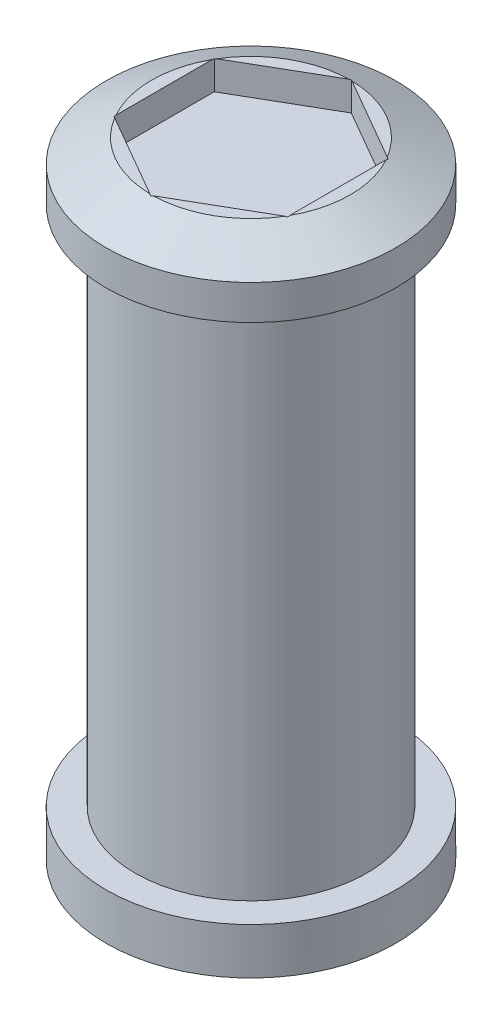
ISO-10303-21;
HEADER;
FILE_DESCRIPTION(('STEP AP214'),'2;1');
FILE_NAME('part.step','',(''),(''),'','','');
FILE_SCHEMA(('AUTOMOTIVE_DESIGN { 1 0 10303 214 1 1 1 1 }'));
ENDSEC;
DATA;
#1=APPLICATION_CONTEXT('core data for automotive mechanical design processes');
#2=APPLICATION_PROTOCOL_DEFINITION('international standard','automotive_design',2000,#1);
#3=PRODUCT_CONTEXT('',#1,'mechanical');
#4=PRODUCT('Part','Part','',(#3));
#5=PRODUCT_RELATED_PRODUCT_CATEGORY('part','',(#4));
#6=PRODUCT_DEFINITION_FORMATION('','',#4);
#7=PRODUCT_DEFINITION_CONTEXT('part definition',#1,'design');
#8=PRODUCT_DEFINITION('design','',#6,#7);
#9=PRODUCT_DEFINITION_SHAPE('','',#8);
#10=(LENGTH_UNIT() NAMED_UNIT(*) SI_UNIT(.MILLI.,.METRE.));
#11=(NAMED_UNIT(*) PLANE_ANGLE_UNIT() SI_UNIT($,.RADIAN.));
#12=(NAMED_UNIT(*) SI_UNIT($,.STERADIAN.) SOLID_ANGLE_UNIT());
#13=UNCERTAINTY_MEASURE_WITH_UNIT(LENGTH_MEASURE(1.E-05),#10,'distance_accuracy_value','');
#14=(GEOMETRIC_REPRESENTATION_CONTEXT(3) GLOBAL_UNCERTAINTY_ASSIGNED_CONTEXT((#13)) GLOBAL_UNIT_ASSIGNED_CONTEXT((#10,
#11,#12)) REPRESENTATION_CONTEXT('',''));
#15=CARTESIAN_POINT('',(0.,0.,0.));
#16=DIRECTION('',(0.,0.,1.));
#17=DIRECTION('',(1.,0.,0.));
#18=AXIS2_PLACEMENT_3D('',#15,#16,#17);
#19=CARTESIAN_POINT('',(0.,254.,0.));
#20=DIRECTION('',(0.,1.,0.));
#21=DIRECTION('',(0.,0.,1.));
#22=AXIS2_PLACEMENT_3D('',#19,#20,#21);
#23=PLANE('',#22);
#24=DIRECTION('',(-0.866025403784439,0.,0.5));
#25=VECTOR('',#24,1.);
#26=CARTESIAN_POINT('',(0.,254.,-43.9940905122495));
#27=LINE('',#26,#25);
#28=CARTESIAN_POINT('',(-0.763675042659631,254.,-43.5531825207965));
#29=VERTEX_POINT('',#28);
#30=CARTESIAN_POINT('',(-37.3363249573404,254.,-22.4379532475777));
#31=VERTEX_POINT('',#30);
#32=EDGE_CURVE('E239',#29,#31,#27,.T.);
#33=ORIENTED_EDGE('',*,*,#32,.F.);
#34=CARTESIAN_POINT('',(0.,254.,0.));
#35=DIRECTION('',(0.,1.,0.));
#36=DIRECTION('',(0.,0.,1.));
#37=AXIS2_PLACEMENT_3D('',#34,#35,#36);
#38=CIRCLE('',#37,43.5598772640672);
#39=EDGE_CURVE('E290',#29,#31,#38,.T.);
#40=ORIENTED_EDGE('',*,*,#39,.T.);
#41=EDGE_LOOP('',(#33,#40));
#42=FACE_BOUND('',#41,.T.);
#43=ADVANCED_FACE('F32',(#42),#23,.T.);
#44=DIRECTION('',(0.,0.,1.));
#45=VECTOR('',#44,1.);
#46=CARTESIAN_POINT('',(-38.1,254.,-21.9970452561247));
#47=LINE('',#46,#45);
#48=CARTESIAN_POINT('',(-38.1,254.,-21.1152292732189));
#49=VERTEX_POINT('',#48);
#50=CARTESIAN_POINT('',(-38.1,254.,21.1152292732189));
#51=VERTEX_POINT('',#50);
#52=EDGE_CURVE('E242',#49,#51,#47,.T.);
#53=ORIENTED_EDGE('',*,*,#52,.F.);
#54=CARTESIAN_POINT('',(0.,254.,0.));
#55=DIRECTION('',(0.,1.,0.));
#56=DIRECTION('',(0.,0.,1.));
#57=AXIS2_PLACEMENT_3D('',#54,#55,#56);
#58=CIRCLE('',#57,43.5598772640672);
#59=EDGE_CURVE('E288',#49,#51,#58,.T.);
#60=ORIENTED_EDGE('',*,*,#59,.T.);
#61=EDGE_LOOP('',(#53,#60));
#62=FACE_BOUND('',#61,.T.);
#63=ADVANCED_FACE('F361',(#62),#23,.T.);
#64=DIRECTION('',(0.866025403784439,0.,0.5));
#65=VECTOR('',#64,1.);
#66=CARTESIAN_POINT('',(-38.1,254.,21.9970452561248));
#67=LINE('',#66,#65);
#68=CARTESIAN_POINT('',(-37.3363249573404,254.,22.4379532475777));
#69=VERTEX_POINT('',#68);
#70=CARTESIAN_POINT('',(-0.763675042659596,254.,43.5531825207966));
#71=VERTEX_POINT('',#70);
#72=EDGE_CURVE('E245',#69,#71,#67,.T.);
#73=ORIENTED_EDGE('',*,*,#72,.F.);
#74=CARTESIAN_POINT('',(0.,254.,0.));
#75=DIRECTION('',(0.,1.,0.));
#76=DIRECTION('',(0.,0.,1.));
#77=AXIS2_PLACEMENT_3D('',#74,#75,#76);
#78=CIRCLE('',#77,43.5598772640672);
#79=EDGE_CURVE('E286',#69,#71,#78,.T.);
#80=ORIENTED_EDGE('',*,*,#79,.T.);
#81=EDGE_LOOP('',(#73,#80));
#82=FACE_BOUND('',#81,.T.);
#83=ADVANCED_FACE('F368',(#82),#23,.T.);
#84=DIRECTION('',(0.866025403784439,0.,-0.5));
#85=VECTOR('',#84,1.);
#86=CARTESIAN_POINT('',(0.,254.,43.9940905122495));
#87=LINE('',#86,#85);
#88=CARTESIAN_POINT('',(0.763675042659617,254.,43.5531825207966));
#89=VERTEX_POINT('',#88);
#90=CARTESIAN_POINT('',(37.3363249573404,254.,22.4379532475777));
#91=VERTEX_POINT('',#90);
#92=EDGE_CURVE('E248',#89,#91,#87,.T.);
#93=ORIENTED_EDGE('',*,*,#92,.F.);
#94=CARTESIAN_POINT('',(0.,254.,0.));
#95=DIRECTION('',(0.,1.,0.));
#96=DIRECTION('',(0.,0.,1.));
#97=AXIS2_PLACEMENT_3D('',#94,#95,#96);
#98=CIRCLE('',#97,43.5598772640672);
#99=EDGE_CURVE('E284',#89,#91,#98,.T.);
#100=ORIENTED_EDGE('',*,*,#99,.T.);
#101=EDGE_LOOP('',(#93,#100));
#102=FACE_BOUND('',#101,.T.);
#103=ADVANCED_FACE('F389',(#102),#23,.T.);
#104=DIRECTION('',(0.,0.,-1.));
#105=VECTOR('',#104,1.);
#106=CARTESIAN_POINT('',(38.1,254.,21.9970452561247));
#107=LINE('',#106,#105);
#108=CARTESIAN_POINT('',(38.1,254.,21.1152292732189));
#109=VERTEX_POINT('',#108);
#110=CARTESIAN_POINT('',(38.1,254.,-21.1152292732189));
#111=VERTEX_POINT('',#110);
#112=EDGE_CURVE('E221',#109,#111,#107,.T.);
#113=ORIENTED_EDGE('',*,*,#112,.F.);
#114=CARTESIAN_POINT('',(0.,254.,0.));
#115=DIRECTION('',(0.,1.,0.));
#116=DIRECTION('',(0.,0.,1.));
#117=AXIS2_PLACEMENT_3D('',#114,#115,#116);
#118=CIRCLE('',#117,43.5598772640672);
#119=EDGE_CURVE('E282',#109,#111,#118,.T.);
#120=ORIENTED_EDGE('',*,*,#119,.T.);
#121=EDGE_LOOP('',(#113,#120));
#122=FACE_BOUND('',#121,.T.);
#123=ADVANCED_FACE('F377',(#122),#23,.T.);
#124=CARTESIAN_POINT('',(0.,228.6,0.));
#125=DIRECTION('',(0.,-1.,0.));
#126=DIRECTION('',(0.,0.,-1.));
#127=AXIS2_PLACEMENT_3D('',#124,#125,#126);
#128=CYLINDRICAL_SURFACE('',#127,50.8);
#129=CARTESIAN_POINT('',(0.,228.6,0.));
#130=DIRECTION('',(0.,1.,0.));
#131=DIRECTION('',(0.,0.,1.));
#132=AXIS2_PLACEMENT_3D('',#129,#130,#131);
#133=CIRCLE('',#132,50.8);
#134=CARTESIAN_POINT('',(0.,228.6,50.8));
#135=VERTEX_POINT('',#134);
#136=EDGE_CURVE('E277',#135,#135,#133,.T.);
#137=ORIENTED_EDGE('',*,*,#136,.F.);
#138=EDGE_LOOP('',(#137));
#139=FACE_BOUND('',#138,.T.);
#140=CARTESIAN_POINT('',(0.,0.,0.));
#141=DIRECTION('',(0.,-1.,0.));
#142=DIRECTION('',(0.,0.,-1.));
#143=AXIS2_PLACEMENT_3D('',#140,#141,#142);
#144=CIRCLE('',#143,50.8);
#145=CARTESIAN_POINT('',(0.,0.,-50.8));
#146=VERTEX_POINT('',#145);
#147=EDGE_CURVE('E271',#146,#146,#144,.T.);
#148=ORIENTED_EDGE('',*,*,#147,.F.);
#149=EDGE_LOOP('',(#148));
#150=FACE_BOUND('',#149,.T.);
#151=ADVANCED_FACE('F384',(#139,#150),#128,.T.);
#152=CARTESIAN_POINT('',(0.,254.,0.));
#153=DIRECTION('',(0.,-1.,0.));
#154=DIRECTION('',(0.,0.,-1.));
#155=AXIS2_PLACEMENT_3D('',#152,#153,#154);
#156=CYLINDRICAL_SURFACE('',#155,63.5);
#157=CARTESIAN_POINT('',(0.,243.84,0.));
#158=DIRECTION('',(0.,1.,0.));
#159=DIRECTION('',(0.,0.,1.));
#160=AXIS2_PLACEMENT_3D('',#157,#158,#159);
#161=CIRCLE('',#160,63.5);
#162=CARTESIAN_POINT('',(0.,243.84,63.5));
#163=VERTEX_POINT('',#162);
#164=EDGE_CURVE('E340',#163,#163,#161,.F.);
#165=ORIENTED_EDGE('',*,*,#164,.T.);
#166=EDGE_LOOP('',(#165));
#167=FACE_BOUND('',#166,.T.);
#168=CARTESIAN_POINT('',(0.,228.6,0.));
#169=DIRECTION('',(0.,1.,0.));
#170=DIRECTION('',(0.,0.,1.));
#171=AXIS2_PLACEMENT_3D('',#168,#169,#170);
#172=CIRCLE('',#171,63.5);
#173=CARTESIAN_POINT('',(0.,228.6,63.5));
#174=VERTEX_POINT('',#173);
#175=EDGE_CURVE('E274',#174,#174,#172,.T.);
#176=ORIENTED_EDGE('',*,*,#175,.T.);
#177=EDGE_LOOP('',(#176));
#178=FACE_BOUND('',#177,.T.);
#179=ADVANCED_FACE('F375',(#167,#178),#156,.T.);
#180=DIRECTION('',(-0.866025403784439,0.,-0.5));
#181=VECTOR('',#180,1.);
#182=CARTESIAN_POINT('',(38.1,254.,-21.9970452561248));
#183=LINE('',#182,#181);
#184=CARTESIAN_POINT('',(37.3363249573404,254.,-22.4379532475777));
#185=VERTEX_POINT('',#184);
#186=CARTESIAN_POINT('',(0.7636750426596,254.,-43.5531825207966));
#187=VERTEX_POINT('',#186);
#188=EDGE_CURVE('E209',#185,#187,#183,.T.);
#189=ORIENTED_EDGE('',*,*,#188,.F.);
#190=CARTESIAN_POINT('',(0.,254.,0.));
#191=DIRECTION('',(0.,1.,0.));
#192=DIRECTION('',(0.,0.,1.));
#193=AXIS2_PLACEMENT_3D('',#190,#191,#192);
#194=CIRCLE('',#193,43.5598772640672);
#195=EDGE_CURVE('E280',#185,#187,#194,.T.);
#196=ORIENTED_EDGE('',*,*,#195,.T.);
#197=EDGE_LOOP('',(#189,#196));
#198=FACE_BOUND('',#197,.T.);
#199=ADVANCED_FACE('F364',(#198),#23,.T.);
#200=CARTESIAN_POINT('',(0.,228.6,0.));
#201=DIRECTION('',(0.,1.,0.));
#202=DIRECTION('',(0.,0.,1.));
#203=AXIS2_PLACEMENT_3D('',#200,#201,#202);
#204=PLANE('',#203);
#205=ORIENTED_EDGE('',*,*,#136,.T.);
#206=EDGE_LOOP('',(#205));
#207=FACE_BOUND('',#206,.T.);
#208=ORIENTED_EDGE('',*,*,#175,.F.);
#209=EDGE_LOOP('',(#208));
#210=FACE_BOUND('',#209,.T.);
#211=ADVANCED_FACE('F374',(#207,#210),#204,.F.);
#212=CARTESIAN_POINT('',(0.,-25.4,0.));
#213=DIRECTION('',(0.,1.,0.));
#214=DIRECTION('',(0.,0.,1.));
#215=AXIS2_PLACEMENT_3D('',#212,#213,#214);
#216=CYLINDRICAL_SURFACE('',#215,63.5);
#217=CARTESIAN_POINT('',(0.,-20.32,0.));
#218=DIRECTION('',(0.,-1.,0.));
#219=DIRECTION('',(0.,0.,-1.));
#220=AXIS2_PLACEMENT_3D('',#217,#218,#219);
#221=CIRCLE('',#220,63.5);
#222=CARTESIAN_POINT('',(0.,-20.32,63.5));
#223=VERTEX_POINT('',#222);
#224=EDGE_CURVE('E11',#223,#223,#221,.F.);
#225=ORIENTED_EDGE('',*,*,#224,.T.);
#226=EDGE_LOOP('',(#225));
#227=FACE_BOUND('',#226,.T.);
#228=CARTESIAN_POINT('',(0.,0.,0.));
#229=DIRECTION('',(0.,-1.,0.));
#230=DIRECTION('',(0.,0.,-1.));
#231=AXIS2_PLACEMENT_3D('',#228,#229,#230);
#232=CIRCLE('',#231,63.5);
#233=CARTESIAN_POINT('',(0.,0.,-63.5));
#234=VERTEX_POINT('',#233);
#235=EDGE_CURVE('E254',#234,#234,#232,.T.);
#236=ORIENTED_EDGE('',*,*,#235,.T.);
#237=EDGE_LOOP('',(#236));
#238=FACE_BOUND('',#237,.T.);
#239=ADVANCED_FACE('F382',(#227,#238),#216,.T.);
#240=CARTESIAN_POINT('',(0.,-25.4,0.));
#241=DIRECTION('',(0.,-1.,0.));
#242=DIRECTION('',(0.,0.,-1.));
#243=AXIS2_PLACEMENT_3D('',#240,#241,#242);
#244=PLANE('',#243);
#245=CARTESIAN_POINT('',(0.,-25.4,0.));
#246=DIRECTION('',(0.,-1.,0.));
#247=DIRECTION('',(0.,0.,-1.));
#248=AXIS2_PLACEMENT_3D('',#245,#246,#247);
#249=CIRCLE('',#248,45.7839346252882);
#250=CARTESIAN_POINT('',(0.,-25.4,45.7839346252882));
#251=VERTEX_POINT('',#250);
#252=EDGE_CURVE('E40',#251,#251,#249,.T.);
#253=ORIENTED_EDGE('',*,*,#252,.T.);
#254=EDGE_LOOP('',(#253));
#255=FACE_BOUND('',#254,.T.);
#256=DIRECTION('',(0.866025403784439,0.,0.5));
#257=VECTOR('',#256,1.);
#258=CARTESIAN_POINT('',(19.05,-25.4,-32.9955678841871));
#259=LINE('',#258,#257);
#260=CARTESIAN_POINT('',(0.,-25.4,-43.9940905122495));
#261=VERTEX_POINT('',#260);
#262=CARTESIAN_POINT('',(38.1,-25.4,-21.9970452561247));
#263=VERTEX_POINT('',#262);
#264=EDGE_CURVE('E47',#261,#263,#259,.T.);
#265=ORIENTED_EDGE('',*,*,#264,.F.);
#266=DIRECTION('',(0.866025403784439,0.,-0.5));
#267=VECTOR('',#266,1.);
#268=CARTESIAN_POINT('',(-19.05,-25.4,-32.9955678841871));
#269=LINE('',#268,#267);
#270=CARTESIAN_POINT('',(-38.1,-25.4,-21.9970452561247));
#271=VERTEX_POINT('',#270);
#272=EDGE_CURVE('E179',#271,#261,#269,.T.);
#273=ORIENTED_EDGE('',*,*,#272,.F.);
#274=DIRECTION('',(0.,0.,-1.));
#275=VECTOR('',#274,1.);
#276=CARTESIAN_POINT('',(-38.1,-25.4,0.));
#277=LINE('',#276,#275);
#278=CARTESIAN_POINT('',(-38.1,-25.4,21.9970452561247));
#279=VERTEX_POINT('',#278);
#280=EDGE_CURVE('E182',#279,#271,#277,.T.);
#281=ORIENTED_EDGE('',*,*,#280,.F.);
#282=DIRECTION('',(-0.866025403784438,0.,-0.5));
#283=VECTOR('',#282,1.);
#284=CARTESIAN_POINT('',(-19.05,-25.4,32.9955678841871));
#285=LINE('',#284,#283);
#286=CARTESIAN_POINT('',(0.,-25.4,43.9940905122495));
#287=VERTEX_POINT('',#286);
#288=EDGE_CURVE('E202',#287,#279,#285,.T.);
#289=ORIENTED_EDGE('',*,*,#288,.F.);
#290=DIRECTION('',(-0.866025403784439,0.,0.5));
#291=VECTOR('',#290,1.);
#292=CARTESIAN_POINT('',(19.05,-25.4,32.9955678841871));
#293=LINE('',#292,#291);
#294=CARTESIAN_POINT('',(38.1,-25.4,21.9970452561248));
#295=VERTEX_POINT('',#294);
#296=EDGE_CURVE('E199',#295,#287,#293,.T.);
#297=ORIENTED_EDGE('',*,*,#296,.F.);
#298=DIRECTION('',(0.,0.,1.));
#299=VECTOR('',#298,1.);
#300=CARTESIAN_POINT('',(38.1,-25.4,0.));
#301=LINE('',#300,#299);
#302=EDGE_CURVE('E196',#263,#295,#301,.T.);
#303=ORIENTED_EDGE('',*,*,#302,.F.);
#304=EDGE_LOOP('',(#265,#273,#281,#289,#297,#303));
#305=FACE_BOUND('',#304,.T.);
#306=ADVANCED_FACE('F325',(#255,#305),#244,.T.);
#307=CARTESIAN_POINT('',(0.,0.,0.));
#308=DIRECTION('',(0.,-1.,0.));
#309=DIRECTION('',(0.,0.,-1.));
#310=AXIS2_PLACEMENT_3D('',#307,#308,#309);
#311=PLANE('',#310);
#312=ORIENTED_EDGE('',*,*,#147,.T.);
#313=EDGE_LOOP('',(#312));
#314=FACE_BOUND('',#313,.T.);
#315=ORIENTED_EDGE('',*,*,#235,.F.);
#316=EDGE_LOOP('',(#315));
#317=FACE_BOUND('',#316,.T.);
#318=ADVANCED_FACE('F323',(#314,#317),#311,.F.);
#319=CARTESIAN_POINT('',(38.1,241.3,-21.9970452561248));
#320=DIRECTION('',(0.5,0.,-0.866025403784439));
#321=DIRECTION('',(-0.866025403784439,0.,-0.5));
#322=AXIS2_PLACEMENT_3D('',#319,#320,#321);
#323=PLANE('',#322);
#324=DIRECTION('',(0.,1.,0.));
#325=VECTOR('',#324,1.);
#326=CARTESIAN_POINT('',(38.1,241.3,-21.9970452561248));
#327=LINE('',#326,#325);
#328=CARTESIAN_POINT('',(38.1,241.3,-21.9970452561248));
#329=VERTEX_POINT('',#328);
#330=CARTESIAN_POINT('',(38.1,253.778757299543,-21.9970452561248));
#331=VERTEX_POINT('',#330);
#332=EDGE_CURVE('E252',#329,#331,#327,.T.);
#333=ORIENTED_EDGE('',*,*,#332,.T.);
#334=CARTESIAN_POINT('',(38.1,253.778757299543,-21.9970452561248));
#335=CARTESIAN_POINT('',(37.9728376205798,253.816168599574,-22.0704624901138));
#336=CARTESIAN_POINT('',(37.8456168450378,253.853311140992,-22.1439134391195));
#337=CARTESIAN_POINT('',(37.5910584974885,253.927058707829,-22.2908827696015));
#338=CARTESIAN_POINT('',(37.4637209254773,253.963663733229,-22.3644011510802));
#339=CARTESIAN_POINT('',(37.3363249573404,254.,-22.4379532475777));
#340=B_SPLINE_CURVE_WITH_KNOTS('',3,(#334,#335,#336,#337,#338,#339),.UNSPECIFIED.,.F.,.F.,(4,2,
4),(0.,0.454574112990714,0.909148241059594),.UNSPECIFIED.);
#341=EDGE_CURVE('E335',#331,#185,#340,.T.);
#342=ORIENTED_EDGE('',*,*,#341,.T.);
#343=ORIENTED_EDGE('',*,*,#188,.T.);
#344=CARTESIAN_POINT('',(0.7636750426596,254.,-43.5531825207966));
#345=CARTESIAN_POINT('',(0.63627907452272,253.963663733229,-43.6267346172941));
#346=CARTESIAN_POINT('',(0.50894150251149,253.927058707829,-43.7002529987727));
#347=CARTESIAN_POINT('',(0.254383154962159,253.853311140992,-43.8472223292548));
#348=CARTESIAN_POINT('',(0.127162379420184,253.816168599574,-43.9206732782604));
#349=CARTESIAN_POINT('',(0.,253.778757299544,-43.9940905122495));
#350=B_SPLINE_CURVE_WITH_KNOTS('',3,(#344,#345,#346,#347,#348,#349),.UNSPECIFIED.,.F.,.F.,(4,2,
4),(0.,0.454574128068862,0.909148241059571),.UNSPECIFIED.);
#351=CARTESIAN_POINT('',(0.,253.778757299544,-43.9940905122495));
#352=VERTEX_POINT('',#351);
#353=EDGE_CURVE('E329',#187,#352,#350,.T.);
#354=ORIENTED_EDGE('',*,*,#353,.T.);
#355=DIRECTION('',(0.,1.,0.));
#356=VECTOR('',#355,1.);
#357=CARTESIAN_POINT('',(0.,241.3,-43.9940905122495));
#358=LINE('',#357,#356);
#359=CARTESIAN_POINT('',(0.,241.3,-43.9940905122495));
#360=VERTEX_POINT('',#359);
#361=EDGE_CURVE('E236',#360,#352,#358,.T.);
#362=ORIENTED_EDGE('',*,*,#361,.F.);
#363=DIRECTION('',(-0.866025403784439,0.,-0.5));
#364=VECTOR('',#363,1.);
#365=CARTESIAN_POINT('',(38.1,241.3,-21.9970452561248));
#366=LINE('',#365,#364);
#367=EDGE_CURVE('E217',#329,#360,#366,.T.);
#368=ORIENTED_EDGE('',*,*,#367,.F.);
#369=EDGE_LOOP('',(#333,#342,#343,#354,#362,#368));
#370=FACE_BOUND('',#369,.T.);
#371=ADVANCED_FACE('F317',(#370),#323,.F.);
#372=CARTESIAN_POINT('',(38.1,241.3,21.9970452561247));
#373=DIRECTION('',(1.,0.,0.));
#374=DIRECTION('',(0.,0.,-1.));
#375=AXIS2_PLACEMENT_3D('',#372,#373,#374);
#376=PLANE('',#375);
#377=DIRECTION('',(0.,1.,0.));
#378=VECTOR('',#377,1.);
#379=CARTESIAN_POINT('',(38.1,241.3,21.9970452561247));
#380=LINE('',#379,#378);
#381=CARTESIAN_POINT('',(38.1,241.3,21.9970452561247));
#382=VERTEX_POINT('',#381);
#383=CARTESIAN_POINT('',(38.1,253.778757299543,21.9970452561247));
#384=VERTEX_POINT('',#383);
#385=EDGE_CURVE('E255',#382,#384,#380,.T.);
#386=ORIENTED_EDGE('',*,*,#385,.T.);
#387=CARTESIAN_POINT('',(38.1,253.778757299543,21.9970452561247));
#388=CARTESIAN_POINT('',(38.1,253.816168599574,21.8502107881467));
#389=CARTESIAN_POINT('',(38.1,253.853311140992,21.7033088901353));
#390=CARTESIAN_POINT('',(38.1,253.927058707829,21.4093702291712));
#391=CARTESIAN_POINT('',(38.1,253.963663733229,21.2623334662139));
#392=CARTESIAN_POINT('',(38.1,254.,21.1152292732189));
#393=B_SPLINE_CURVE_WITH_KNOTS('',3,(#387,#388,#389,#390,#391,#392),.UNSPECIFIED.,.F.,.F.,(4,2,
4),(0.,0.454574112990712,0.909148241059592),.UNSPECIFIED.);
#394=EDGE_CURVE('E402',#384,#109,#393,.T.);
#395=ORIENTED_EDGE('',*,*,#394,.T.);
#396=ORIENTED_EDGE('',*,*,#112,.T.);
#397=CARTESIAN_POINT('',(38.1,254.,-21.1152292732189));
#398=CARTESIAN_POINT('',(38.1,253.963663733229,-21.2623334662139));
#399=CARTESIAN_POINT('',(38.1,253.927058707829,-21.4093702291712));
#400=CARTESIAN_POINT('',(38.1,253.853311140992,-21.7033088901353));
#401=CARTESIAN_POINT('',(38.1,253.816168599574,-21.8502107881467));
#402=CARTESIAN_POINT('',(38.1,253.778757299543,-21.9970452561248));
#403=B_SPLINE_CURVE_WITH_KNOTS('',3,(#397,#398,#399,#400,#401,#402),.UNSPECIFIED.,.F.,.F.,(4,2,
4),(0.,0.454574128068887,0.909148241059612),.UNSPECIFIED.);
#404=EDGE_CURVE('E55',#111,#331,#403,.T.);
#405=ORIENTED_EDGE('',*,*,#404,.T.);
#406=ORIENTED_EDGE('',*,*,#332,.F.);
#407=DIRECTION('',(0.,0.,-1.));
#408=VECTOR('',#407,1.);
#409=CARTESIAN_POINT('',(38.1,241.3,21.9970452561247));
#410=LINE('',#409,#408);
#411=EDGE_CURVE('E233',#382,#329,#410,.T.);
#412=ORIENTED_EDGE('',*,*,#411,.F.);
#413=EDGE_LOOP('',(#386,#395,#396,#405,#406,#412));
#414=FACE_BOUND('',#413,.T.);
#415=ADVANCED_FACE('F322',(#414),#376,.F.);
#416=CARTESIAN_POINT('',(0.,241.3,43.9940905122495));
#417=DIRECTION('',(0.5,0.,0.866025403784439));
#418=DIRECTION('',(0.866025403784439,0.,-0.5));
#419=AXIS2_PLACEMENT_3D('',#416,#417,#418);
#420=PLANE('',#419);
#421=DIRECTION('',(0.,1.,0.));
#422=VECTOR('',#421,1.);
#423=CARTESIAN_POINT('',(0.,241.3,43.9940905122495));
#424=LINE('',#423,#422);
#425=CARTESIAN_POINT('',(0.,241.3,43.9940905122495));
#426=VERTEX_POINT('',#425);
#427=CARTESIAN_POINT('',(0.,253.778757299544,43.9940905122495));
#428=VERTEX_POINT('',#427);
#429=EDGE_CURVE('E258',#426,#428,#424,.T.);
#430=ORIENTED_EDGE('',*,*,#429,.T.);
#431=CARTESIAN_POINT('',(0.,253.778757299544,43.9940905122495));
#432=CARTESIAN_POINT('',(0.127162379420206,253.816168599574,43.9206732782604));
#433=CARTESIAN_POINT('',(0.254383154962181,253.853311140992,43.8472223292548));
#434=CARTESIAN_POINT('',(0.508941502511509,253.927058707829,43.7002529987727));
#435=CARTESIAN_POINT('',(0.636279074522737,253.963663733229,43.6267346172941));
#436=CARTESIAN_POINT('',(0.763675042659615,254.,43.5531825207966));
#437=B_SPLINE_CURVE_WITH_KNOTS('',3,(#431,#432,#433,#434,#435,#436),.UNSPECIFIED.,.F.,.F.,(4,2,
4),(0.,0.454574112990703,0.909148241059561),.UNSPECIFIED.);
#438=EDGE_CURVE('E405',#428,#89,#437,.T.);
#439=ORIENTED_EDGE('',*,*,#438,.T.);
#440=ORIENTED_EDGE('',*,*,#92,.T.);
#441=CARTESIAN_POINT('',(37.3363249573404,254.,22.4379532475777));
#442=CARTESIAN_POINT('',(37.4637209254773,253.963663733229,22.3644011510802));
#443=CARTESIAN_POINT('',(37.5910584974885,253.927058707829,22.2908827696015));
#444=CARTESIAN_POINT('',(37.8456168450378,253.853311140992,22.1439134391195));
#445=CARTESIAN_POINT('',(37.9728376205798,253.816168599574,22.0704624901138));
#446=CARTESIAN_POINT('',(38.1,253.778757299543,21.9970452561247));
#447=B_SPLINE_CURVE_WITH_KNOTS('',3,(#441,#442,#443,#444,#445,#446),.UNSPECIFIED.,.F.,.F.,(4,2,
4),(0.,0.454574128068887,0.909148241059608),.UNSPECIFIED.);
#448=EDGE_CURVE('E407',#91,#384,#447,.T.);
#449=ORIENTED_EDGE('',*,*,#448,.T.);
#450=ORIENTED_EDGE('',*,*,#385,.F.);
#451=DIRECTION('',(0.866025403784439,0.,-0.5));
#452=VECTOR('',#451,1.);
#453=CARTESIAN_POINT('',(0.,241.3,43.9940905122495));
#454=LINE('',#453,#452);
#455=EDGE_CURVE('E230',#426,#382,#454,.T.);
#456=ORIENTED_EDGE('',*,*,#455,.F.);
#457=EDGE_LOOP('',(#430,#439,#440,#449,#450,#456));
#458=FACE_BOUND('',#457,.T.);
#459=ADVANCED_FACE('F424',(#458),#420,.F.);
#460=CARTESIAN_POINT('',(-38.1,241.3,21.9970452561248));
#461=DIRECTION('',(-0.5,0.,0.866025403784439));
#462=DIRECTION('',(0.866025403784439,0.,0.5));
#463=AXIS2_PLACEMENT_3D('',#460,#461,#462);
#464=PLANE('',#463);
#465=DIRECTION('',(0.,1.,0.));
#466=VECTOR('',#465,1.);
#467=CARTESIAN_POINT('',(-38.1,241.3,21.9970452561248));
#468=LINE('',#467,#466);
#469=CARTESIAN_POINT('',(-38.1,241.3,21.9970452561248));
#470=VERTEX_POINT('',#469);
#471=CARTESIAN_POINT('',(-38.1,253.778757299544,21.9970452561248));
#472=VERTEX_POINT('',#471);
#473=EDGE_CURVE('E261',#470,#472,#468,.T.);
#474=ORIENTED_EDGE('',*,*,#473,.T.);
#475=CARTESIAN_POINT('',(-38.1,253.778757299544,21.9970452561248));
#476=CARTESIAN_POINT('',(-37.9728376205798,253.816168599574,22.0704624901138));
#477=CARTESIAN_POINT('',(-37.8456168450378,253.853311140992,22.1439134391195));
#478=CARTESIAN_POINT('',(-37.5910584974885,253.927058707829,22.2908827696015));
#479=CARTESIAN_POINT('',(-37.4637209254772,253.963663733229,22.3644011510802));
#480=CARTESIAN_POINT('',(-37.3363249573404,254.,22.4379532475777));
#481=B_SPLINE_CURVE_WITH_KNOTS('',3,(#475,#476,#477,#478,#479,#480),.UNSPECIFIED.,.F.,.F.,(4,2,
4),(0.,0.454574112990715,0.90914824105958),.UNSPECIFIED.);
#482=EDGE_CURVE('E437',#472,#69,#481,.T.);
#483=ORIENTED_EDGE('',*,*,#482,.T.);
#484=ORIENTED_EDGE('',*,*,#72,.T.);
#485=CARTESIAN_POINT('',(-0.76367504265961,254.,43.5531825207966));
#486=CARTESIAN_POINT('',(-0.636279074522731,253.963663733229,43.6267346172941));
#487=CARTESIAN_POINT('',(-0.508941502511501,253.927058707829,43.7002529987727));
#488=CARTESIAN_POINT('',(-0.254383154962169,253.853311140992,43.8472223292548));
#489=CARTESIAN_POINT('',(-0.127162379420193,253.816168599574,43.9206732782604));
#490=CARTESIAN_POINT('',(0.,253.778757299544,43.9940905122495));
#491=B_SPLINE_CURVE_WITH_KNOTS('',3,(#485,#486,#487,#488,#489,#490),.UNSPECIFIED.,.F.,.F.,(4,2,
4),(0.,0.454574128068862,0.90914824105957),.UNSPECIFIED.);
#492=EDGE_CURVE('E442',#71,#428,#491,.T.);
#493=ORIENTED_EDGE('',*,*,#492,.T.);
#494=ORIENTED_EDGE('',*,*,#429,.F.);
#495=DIRECTION('',(0.866025403784439,0.,0.5));
#496=VECTOR('',#495,1.);
#497=CARTESIAN_POINT('',(-38.1,241.3,21.9970452561248));
#498=LINE('',#497,#496);
#499=EDGE_CURVE('E227',#470,#426,#498,.T.);
#500=ORIENTED_EDGE('',*,*,#499,.F.);
#501=EDGE_LOOP('',(#474,#483,#484,#493,#494,#500));
#502=FACE_BOUND('',#501,.T.);
#503=ADVANCED_FACE('F429',(#502),#464,.F.);
#504=CARTESIAN_POINT('',(-38.1,241.3,-21.9970452561247));
#505=DIRECTION('',(-1.,0.,0.));
#506=DIRECTION('',(0.,0.,1.));
#507=AXIS2_PLACEMENT_3D('',#504,#505,#506);
#508=PLANE('',#507);
#509=DIRECTION('',(0.,1.,0.));
#510=VECTOR('',#509,1.);
#511=CARTESIAN_POINT('',(-38.1,241.3,-21.9970452561247));
#512=LINE('',#511,#510);
#513=CARTESIAN_POINT('',(-38.1,241.3,-21.9970452561247));
#514=VERTEX_POINT('',#513);
#515=CARTESIAN_POINT('',(-38.1,253.778757299543,-21.9970452561247));
#516=VERTEX_POINT('',#515);
#517=EDGE_CURVE('E264',#514,#516,#512,.T.);
#518=ORIENTED_EDGE('',*,*,#517,.T.);
#519=CARTESIAN_POINT('',(-38.1,253.778757299543,-21.9970452561247));
#520=CARTESIAN_POINT('',(-38.1,253.816168599574,-21.8502107881467));
#521=CARTESIAN_POINT('',(-38.1,253.853311140992,-21.7033088901353));
#522=CARTESIAN_POINT('',(-38.1,253.927058707829,-21.4093702291712));
#523=CARTESIAN_POINT('',(-38.1,253.963663733229,-21.2623334662139));
#524=CARTESIAN_POINT('',(-38.1,254.,-21.1152292732189));
#525=B_SPLINE_CURVE_WITH_KNOTS('',3,(#519,#520,#521,#522,#523,#524),.UNSPECIFIED.,.F.,.F.,(4,2,
4),(0.,0.454574112990719,0.909148241059599),.UNSPECIFIED.);
#526=EDGE_CURVE('E447',#516,#49,#525,.T.);
#527=ORIENTED_EDGE('',*,*,#526,.T.);
#528=ORIENTED_EDGE('',*,*,#52,.T.);
#529=CARTESIAN_POINT('',(-38.1,254.,21.1152292732189));
#530=CARTESIAN_POINT('',(-38.1,253.963663733229,21.2623334662139));
#531=CARTESIAN_POINT('',(-38.1,253.927058707829,21.4093702291712));
#532=CARTESIAN_POINT('',(-38.1,253.853311140992,21.7033088901353));
#533=CARTESIAN_POINT('',(-38.1,253.816168599574,21.8502107881467));
#534=CARTESIAN_POINT('',(-38.1,253.778757299544,21.9970452561248));
#535=B_SPLINE_CURVE_WITH_KNOTS('',3,(#529,#530,#531,#532,#533,#534),.UNSPECIFIED.,.F.,.F.,(4,2,
4),(0.,0.454574128068866,0.909148241059579),.UNSPECIFIED.);
#536=EDGE_CURVE('E451',#51,#472,#535,.T.);
#537=ORIENTED_EDGE('',*,*,#536,.T.);
#538=ORIENTED_EDGE('',*,*,#473,.F.);
#539=DIRECTION('',(0.,0.,1.));
#540=VECTOR('',#539,1.);
#541=CARTESIAN_POINT('',(-38.1,241.3,-21.9970452561247));
#542=LINE('',#541,#540);
#543=EDGE_CURVE('E224',#514,#470,#542,.T.);
#544=ORIENTED_EDGE('',*,*,#543,.F.);
#545=EDGE_LOOP('',(#518,#527,#528,#537,#538,#544));
#546=FACE_BOUND('',#545,.T.);
#547=ADVANCED_FACE('F313',(#546),#508,.F.);
#548=CARTESIAN_POINT('',(0.,241.3,-43.9940905122495));
#549=DIRECTION('',(-0.5,0.,-0.866025403784439));
#550=DIRECTION('',(-0.866025403784439,0.,0.5));
#551=AXIS2_PLACEMENT_3D('',#548,#549,#550);
#552=PLANE('',#551);
#553=ORIENTED_EDGE('',*,*,#32,.T.);
#554=CARTESIAN_POINT('',(-37.3363249573404,254.,-22.4379532475777));
#555=CARTESIAN_POINT('',(-37.4637209254772,253.963663733229,-22.3644011510802));
#556=CARTESIAN_POINT('',(-37.5910584974885,253.927058707829,-22.2908827696015));
#557=CARTESIAN_POINT('',(-37.8456168450378,253.853311140992,-22.1439134391195));
#558=CARTESIAN_POINT('',(-37.9728376205798,253.816168599574,-22.0704624901138));
#559=CARTESIAN_POINT('',(-38.1,253.778757299543,-21.9970452561247));
#560=B_SPLINE_CURVE_WITH_KNOTS('',3,(#554,#555,#556,#557,#558,#559),.UNSPECIFIED.,.F.,.F.,(4,2,
4),(0.,0.454574128068891,0.909148241059628),.UNSPECIFIED.);
#561=EDGE_CURVE('E299',#31,#516,#560,.T.);
#562=ORIENTED_EDGE('',*,*,#561,.T.);
#563=ORIENTED_EDGE('',*,*,#517,.F.);
#564=DIRECTION('',(-0.866025403784439,0.,0.5));
#565=VECTOR('',#564,1.);
#566=CARTESIAN_POINT('',(0.,241.3,-43.9940905122495));
#567=LINE('',#566,#565);
#568=EDGE_CURVE('E220',#360,#514,#567,.T.);
#569=ORIENTED_EDGE('',*,*,#568,.F.);
#570=ORIENTED_EDGE('',*,*,#361,.T.);
#571=CARTESIAN_POINT('',(0.,253.778757299544,-43.9940905122495));
#572=CARTESIAN_POINT('',(-0.127162379420213,253.816168599574,-43.9206732782604));
#573=CARTESIAN_POINT('',(-0.254383154962188,253.853311140992,-43.8472223292548));
#574=CARTESIAN_POINT('',(-0.508941502511519,253.927058707829,-43.7002529987727));
#575=CARTESIAN_POINT('',(-0.636279074522748,253.963663733229,-43.626734617294));
#576=CARTESIAN_POINT('',(-0.763675042659628,254.,-43.5531825207966));
#577=B_SPLINE_CURVE_WITH_KNOTS('',3,(#571,#572,#573,#574,#575,#576),.UNSPECIFIED.,.F.,.F.,(4,2,
4),(0.,0.454574112990708,0.909148241059566),.UNSPECIFIED.);
#578=EDGE_CURVE('E293',#352,#29,#577,.T.);
#579=ORIENTED_EDGE('',*,*,#578,.T.);
#580=EDGE_LOOP('',(#553,#562,#563,#569,#570,#579));
#581=FACE_BOUND('',#580,.T.);
#582=ADVANCED_FACE('F307',(#581),#552,.F.);
#583=CARTESIAN_POINT('',(0.,241.3,0.));
#584=DIRECTION('',(0.,1.,0.));
#585=DIRECTION('',(0.,0.,1.));
#586=AXIS2_PLACEMENT_3D('',#583,#584,#585);
#587=PLANE('',#586);
#588=ORIENTED_EDGE('',*,*,#367,.T.);
#589=ORIENTED_EDGE('',*,*,#568,.T.);
#590=ORIENTED_EDGE('',*,*,#543,.T.);
#591=ORIENTED_EDGE('',*,*,#499,.T.);
#592=ORIENTED_EDGE('',*,*,#455,.T.);
#593=ORIENTED_EDGE('',*,*,#411,.T.);
#594=EDGE_LOOP('',(#588,#589,#590,#591,#592,#593));
#595=FACE_BOUND('',#594,.T.);
#596=ADVANCED_FACE('F312',(#595),#587,.T.);
#597=CARTESIAN_POINT('',(0.,254.,0.));
#598=DIRECTION('',(0.,-1.,0.));
#599=DIRECTION('',(0.,0.,-1.));
#600=AXIS2_PLACEMENT_3D('',#597,#598,#599);
#601=CONICAL_SURFACE('',#600,43.5598772640672,1.09955742875643);
#602=ORIENTED_EDGE('',*,*,#164,.F.);
#603=EDGE_LOOP('',(#602));
#604=FACE_BOUND('',#603,.T.);
#605=ORIENTED_EDGE('',*,*,#561,.F.);
#606=ORIENTED_EDGE('',*,*,#39,.F.);
#607=ORIENTED_EDGE('',*,*,#578,.F.);
#608=ORIENTED_EDGE('',*,*,#353,.F.);
#609=ORIENTED_EDGE('',*,*,#195,.F.);
#610=ORIENTED_EDGE('',*,*,#341,.F.);
#611=ORIENTED_EDGE('',*,*,#404,.F.);
#612=ORIENTED_EDGE('',*,*,#119,.F.);
#613=ORIENTED_EDGE('',*,*,#394,.F.);
#614=ORIENTED_EDGE('',*,*,#448,.F.);
#615=ORIENTED_EDGE('',*,*,#99,.F.);
#616=ORIENTED_EDGE('',*,*,#438,.F.);
#617=ORIENTED_EDGE('',*,*,#492,.F.);
#618=ORIENTED_EDGE('',*,*,#79,.F.);
#619=ORIENTED_EDGE('',*,*,#482,.F.);
#620=ORIENTED_EDGE('',*,*,#536,.F.);
#621=ORIENTED_EDGE('',*,*,#59,.F.);
#622=ORIENTED_EDGE('',*,*,#526,.F.);
#623=EDGE_LOOP('',(#605,#606,#607,#608,#609,#610,#611,#612,#613,#614,#615,#616,#617,#618,#619,
#620,#621,#622));
#624=FACE_BOUND('',#623,.T.);
#625=ADVANCED_FACE('F304',(#604,#624),#601,.T.);
#626=CARTESIAN_POINT('',(19.05,-12.7,-32.9955678841871));
#627=DIRECTION('',(0.5,0.,-0.866025403784439));
#628=DIRECTION('',(-0.866025403784439,0.,-0.5));
#629=AXIS2_PLACEMENT_3D('',#626,#627,#628);
#630=PLANE('',#629);
#631=ORIENTED_EDGE('',*,*,#264,.T.);
#632=DIRECTION('',(0.,-1.,0.));
#633=VECTOR('',#632,1.);
#634=CARTESIAN_POINT('',(38.1,-12.7,-21.9970452561247));
#635=LINE('',#634,#633);
#636=CARTESIAN_POINT('',(38.1,-12.7,-21.9970452561247));
#637=VERTEX_POINT('',#636);
#638=EDGE_CURVE('E156',#637,#263,#635,.T.);
#639=ORIENTED_EDGE('',*,*,#638,.F.);
#640=DIRECTION('',(0.866025403784439,0.,0.5));
#641=VECTOR('',#640,1.);
#642=CARTESIAN_POINT('',(19.05,-12.7,-32.9955678841871));
#643=LINE('',#642,#641);
#644=CARTESIAN_POINT('',(0.,-12.7,-43.9940905122495));
#645=VERTEX_POINT('',#644);
#646=EDGE_CURVE('E160',#645,#637,#643,.T.);
#647=ORIENTED_EDGE('',*,*,#646,.F.);
#648=DIRECTION('',(0.,-1.,0.));
#649=VECTOR('',#648,1.);
#650=CARTESIAN_POINT('',(0.,-12.7,-43.9940905122495));
#651=LINE('',#650,#649);
#652=EDGE_CURVE('E207',#645,#261,#651,.T.);
#653=ORIENTED_EDGE('',*,*,#652,.T.);
#654=EDGE_LOOP('',(#631,#639,#647,#653));
#655=FACE_BOUND('',#654,.T.);
#656=ADVANCED_FACE('F158',(#655),#630,.F.);
#657=CARTESIAN_POINT('',(-19.05,-12.7,-32.9955678841871));
#658=DIRECTION('',(-0.5,0.,-0.866025403784439));
#659=DIRECTION('',(-0.866025403784439,0.,0.5));
#660=AXIS2_PLACEMENT_3D('',#657,#658,#659);
#661=PLANE('',#660);
#662=ORIENTED_EDGE('',*,*,#272,.T.);
#663=ORIENTED_EDGE('',*,*,#652,.F.);
#664=DIRECTION('',(0.866025403784439,0.,-0.5));
#665=VECTOR('',#664,1.);
#666=CARTESIAN_POINT('',(-19.05,-12.7,-32.9955678841871));
#667=LINE('',#666,#665);
#668=CARTESIAN_POINT('',(-38.1,-12.7,-21.9970452561247));
#669=VERTEX_POINT('',#668);
#670=EDGE_CURVE('E166',#669,#645,#667,.T.);
#671=ORIENTED_EDGE('',*,*,#670,.F.);
#672=DIRECTION('',(0.,-1.,0.));
#673=VECTOR('',#672,1.);
#674=CARTESIAN_POINT('',(-38.1,-12.7,-21.9970452561247));
#675=LINE('',#674,#673);
#676=EDGE_CURVE('E210',#669,#271,#675,.T.);
#677=ORIENTED_EDGE('',*,*,#676,.T.);
#678=EDGE_LOOP('',(#662,#663,#671,#677));
#679=FACE_BOUND('',#678,.T.);
#680=ADVANCED_FACE('F555',(#679),#661,.F.);
#681=CARTESIAN_POINT('',(-38.1,-12.7,0.));
#682=DIRECTION('',(-1.,0.,0.));
#683=DIRECTION('',(0.,0.,1.));
#684=AXIS2_PLACEMENT_3D('',#681,#682,#683);
#685=PLANE('',#684);
#686=ORIENTED_EDGE('',*,*,#280,.T.);
#687=ORIENTED_EDGE('',*,*,#676,.F.);
#688=DIRECTION('',(0.,0.,-1.));
#689=VECTOR('',#688,1.);
#690=CARTESIAN_POINT('',(-38.1,-12.7,0.));
#691=LINE('',#690,#689);
#692=CARTESIAN_POINT('',(-38.1,-12.7,21.9970452561247));
#693=VERTEX_POINT('',#692);
#694=EDGE_CURVE('E192',#693,#669,#691,.T.);
#695=ORIENTED_EDGE('',*,*,#694,.F.);
#696=DIRECTION('',(0.,-1.,0.));
#697=VECTOR('',#696,1.);
#698=CARTESIAN_POINT('',(-38.1,-12.7,21.9970452561247));
#699=LINE('',#698,#697);
#700=EDGE_CURVE('E212',#693,#279,#699,.T.);
#701=ORIENTED_EDGE('',*,*,#700,.T.);
#702=EDGE_LOOP('',(#686,#687,#695,#701));
#703=FACE_BOUND('',#702,.T.);
#704=ADVANCED_FACE('F563',(#703),#685,.F.);
#705=CARTESIAN_POINT('',(-19.05,-12.7,32.9955678841871));
#706=DIRECTION('',(-0.5,0.,0.866025403784438));
#707=DIRECTION('',(0.866025403784438,0.,0.5));
#708=AXIS2_PLACEMENT_3D('',#705,#706,#707);
#709=PLANE('',#708);
#710=ORIENTED_EDGE('',*,*,#288,.T.);
#711=ORIENTED_EDGE('',*,*,#700,.F.);
#712=DIRECTION('',(-0.866025403784438,0.,-0.5));
#713=VECTOR('',#712,1.);
#714=CARTESIAN_POINT('',(-19.05,-12.7,32.9955678841871));
#715=LINE('',#714,#713);
#716=CARTESIAN_POINT('',(0.,-12.7,43.9940905122495));
#717=VERTEX_POINT('',#716);
#718=EDGE_CURVE('E189',#717,#693,#715,.T.);
#719=ORIENTED_EDGE('',*,*,#718,.F.);
#720=DIRECTION('',(0.,-1.,0.));
#721=VECTOR('',#720,1.);
#722=CARTESIAN_POINT('',(0.,-12.7,43.9940905122495));
#723=LINE('',#722,#721);
#724=EDGE_CURVE('E214',#717,#287,#723,.T.);
#725=ORIENTED_EDGE('',*,*,#724,.T.);
#726=EDGE_LOOP('',(#710,#711,#719,#725));
#727=FACE_BOUND('',#726,.T.);
#728=ADVANCED_FACE('F573',(#727),#709,.F.);
#729=CARTESIAN_POINT('',(19.05,-12.7,32.9955678841871));
#730=DIRECTION('',(0.5,0.,0.866025403784439));
#731=DIRECTION('',(0.866025403784439,0.,-0.5));
#732=AXIS2_PLACEMENT_3D('',#729,#730,#731);
#733=PLANE('',#732);
#734=ORIENTED_EDGE('',*,*,#296,.T.);
#735=ORIENTED_EDGE('',*,*,#724,.F.);
#736=DIRECTION('',(-0.866025403784439,0.,0.5));
#737=VECTOR('',#736,1.);
#738=CARTESIAN_POINT('',(19.05,-12.7,32.9955678841871));
#739=LINE('',#738,#737);
#740=CARTESIAN_POINT('',(38.1,-12.7,21.9970452561248));
#741=VERTEX_POINT('',#740);
#742=EDGE_CURVE('E174',#741,#717,#739,.T.);
#743=ORIENTED_EDGE('',*,*,#742,.F.);
#744=DIRECTION('',(0.,-1.,0.));
#745=VECTOR('',#744,1.);
#746=CARTESIAN_POINT('',(38.1,-12.7,21.9970452561248));
#747=LINE('',#746,#745);
#748=EDGE_CURVE('E165',#741,#295,#747,.T.);
#749=ORIENTED_EDGE('',*,*,#748,.T.);
#750=EDGE_LOOP('',(#734,#735,#743,#749));
#751=FACE_BOUND('',#750,.T.);
#752=ADVANCED_FACE('F583',(#751),#733,.F.);
#753=CARTESIAN_POINT('',(38.1,-12.7,0.));
#754=DIRECTION('',(1.,0.,0.));
#755=DIRECTION('',(0.,0.,-1.));
#756=AXIS2_PLACEMENT_3D('',#753,#754,#755);
#757=PLANE('',#756);
#758=ORIENTED_EDGE('',*,*,#302,.T.);
#759=ORIENTED_EDGE('',*,*,#748,.F.);
#760=DIRECTION('',(0.,0.,1.));
#761=VECTOR('',#760,1.);
#762=CARTESIAN_POINT('',(38.1,-12.7,0.));
#763=LINE('',#762,#761);
#764=EDGE_CURVE('E169',#637,#741,#763,.T.);
#765=ORIENTED_EDGE('',*,*,#764,.F.);
#766=ORIENTED_EDGE('',*,*,#638,.T.);
#767=EDGE_LOOP('',(#758,#759,#765,#766));
#768=FACE_BOUND('',#767,.T.);
#769=ADVANCED_FACE('F170',(#768),#757,.F.);
#770=CARTESIAN_POINT('',(0.,-12.7,0.));
#771=DIRECTION('',(0.,-1.,0.));
#772=DIRECTION('',(0.,0.,-1.));
#773=AXIS2_PLACEMENT_3D('',#770,#771,#772);
#774=PLANE('',#773);
#775=CARTESIAN_POINT('',(0.,-12.7,0.));
#776=DIRECTION('',(0.,-1.,0.));
#777=DIRECTION('',(0.,0.,-1.));
#778=AXIS2_PLACEMENT_3D('',#775,#776,#777);
#779=CIRCLE('',#778,31.75);
#780=CARTESIAN_POINT('',(0.,-12.7,-31.75));
#781=VERTEX_POINT('',#780);
#782=EDGE_CURVE('E185',#781,#781,#779,.T.);
#783=ORIENTED_EDGE('',*,*,#782,.F.);
#784=EDGE_LOOP('',(#783));
#785=FACE_BOUND('',#784,.T.);
#786=ORIENTED_EDGE('',*,*,#646,.T.);
#787=ORIENTED_EDGE('',*,*,#764,.T.);
#788=ORIENTED_EDGE('',*,*,#742,.T.);
#789=ORIENTED_EDGE('',*,*,#718,.T.);
#790=ORIENTED_EDGE('',*,*,#694,.T.);
#791=ORIENTED_EDGE('',*,*,#670,.T.);
#792=EDGE_LOOP('',(#786,#787,#788,#789,#790,#791));
#793=FACE_BOUND('',#792,.T.);
#794=ADVANCED_FACE('F176',(#785,#793),#774,.T.);
#795=CARTESIAN_POINT('',(0.,-25.4,0.));
#796=DIRECTION('',(0.,1.,0.));
#797=DIRECTION('',(0.,0.,1.));
#798=AXIS2_PLACEMENT_3D('',#795,#796,#797);
#799=CONICAL_SURFACE('',#798,45.7839346252882,1.2915436464758);
#800=CARTESIAN_POINT('',(0.,-20.32,63.5));
#801=CARTESIAN_POINT('',(0.,-20.3729166666667,63.3154576523468));
#802=CARTESIAN_POINT('',(0.,-20.4258333333333,63.1309153046935));
#803=CARTESIAN_POINT('',(0.,-20.5316666666667,62.761830609387));
#804=CARTESIAN_POINT('',(0.,-20.5845833333333,62.5772882617338));
#805=CARTESIAN_POINT('',(0.,-20.6904166666667,62.2082035664273));
#806=CARTESIAN_POINT('',(0.,-20.7433333333333,62.023661218774));
#807=CARTESIAN_POINT('',(0.,-20.8491666666667,61.6545765234675));
#808=CARTESIAN_POINT('',(0.,-20.9020833333333,61.4700341758143));
#809=CARTESIAN_POINT('',(0.,-21.0079166666667,61.1009494805078));
#810=CARTESIAN_POINT('',(0.,-21.0608333333333,60.9164071328545));
#811=CARTESIAN_POINT('',(0.,-21.1666666666667,60.547322437548));
#812=CARTESIAN_POINT('',(0.,-21.2195833333333,60.3627800898948));
#813=CARTESIAN_POINT('',(0.,-21.3254166666667,59.9936953945883));
#814=CARTESIAN_POINT('',(0.,-21.3783333333333,59.809153046935));
#815=CARTESIAN_POINT('',(0.,-21.4841666666667,59.4400683516285));
#816=CARTESIAN_POINT('',(0.,-21.5370833333333,59.2555260039753));
#817=CARTESIAN_POINT('',(0.,-21.6429166666667,58.8864413086688));
#818=CARTESIAN_POINT('',(0.,-21.6958333333333,58.7018989610156));
#819=CARTESIAN_POINT('',(0.,-21.8016666666667,58.3328142657091));
#820=CARTESIAN_POINT('',(0.,-21.8545833333333,58.1482719180558));
#821=CARTESIAN_POINT('',(0.,-21.9604166666667,57.7791872227493));
#822=CARTESIAN_POINT('',(0.,-22.0133333333333,57.5946448750961));
#823=CARTESIAN_POINT('',(0.,-22.1191666666667,57.2255601797896));
#824=CARTESIAN_POINT('',(0.,-22.1720833333333,57.0410178321363));
#825=CARTESIAN_POINT('',(0.,-22.2779166666667,56.6719331368298));
#826=CARTESIAN_POINT('',(0.,-22.3308333333333,56.4873907891766));
#827=CARTESIAN_POINT('',(0.,-22.4366666666667,56.1183060938701));
#828=CARTESIAN_POINT('',(0.,-22.4895833333333,55.9337637462168));
#829=CARTESIAN_POINT('',(0.,-22.5954166666667,55.5646790509103));
#830=CARTESIAN_POINT('',(0.,-22.6483333333333,55.3801367032571));
#831=CARTESIAN_POINT('',(0.,-22.7541666666667,55.0110520079506));
#832=CARTESIAN_POINT('',(0.,-22.8070833333333,54.8265096602973));
#833=CARTESIAN_POINT('',(0.,-22.9129166666667,54.4574249649908));
#834=CARTESIAN_POINT('',(0.,-22.9658333333333,54.2728826173376));
#835=CARTESIAN_POINT('',(0.,-23.0716666666667,53.9037979220311));
#836=CARTESIAN_POINT('',(0.,-23.1245833333333,53.7192555743779));
#837=CARTESIAN_POINT('',(0.,-23.2304166666667,53.3501708790714));
#838=CARTESIAN_POINT('',(0.,-23.2833333333333,53.1656285314181));
#839=CARTESIAN_POINT('',(0.,-23.3891666666667,52.7965438361116));
#840=CARTESIAN_POINT('',(0.,-23.4420833333333,52.6120014884584));
#841=CARTESIAN_POINT('',(0.,-23.5479166666667,52.2429167931519));
#842=CARTESIAN_POINT('',(0.,-23.6008333333333,52.0583744454986));
#843=CARTESIAN_POINT('',(0.,-23.7066666666667,51.6892897501921));
#844=CARTESIAN_POINT('',(0.,-23.7595833333333,51.5047474025389));
#845=CARTESIAN_POINT('',(0.,-23.8654166666667,51.1356627072324));
#846=CARTESIAN_POINT('',(0.,-23.9183333333333,50.9511203595791));
#847=CARTESIAN_POINT('',(0.,-24.0241666666667,50.5820356642726));
#848=CARTESIAN_POINT('',(0.,-24.0770833333333,50.3974933166194));
#849=CARTESIAN_POINT('',(0.,-24.1829166666667,50.0284086213129));
#850=CARTESIAN_POINT('',(0.,-24.2358333333333,49.8438662736596));
#851=CARTESIAN_POINT('',(0.,-24.3416666666667,49.4747815783531));
#852=CARTESIAN_POINT('',(0.,-24.3945833333333,49.2902392306999));
#853=CARTESIAN_POINT('',(0.,-24.5004166666667,48.9211545353934));
#854=CARTESIAN_POINT('',(0.,-24.5533333333333,48.7366121877402));
#855=CARTESIAN_POINT('',(0.,-24.6591666666667,48.3675274924337));
#856=CARTESIAN_POINT('',(0.,-24.7120833333333,48.1829851447804));
#857=CARTESIAN_POINT('',(0.,-24.8179166666667,47.8139004494739));
#858=CARTESIAN_POINT('',(0.,-24.8708333333333,47.6293581018207));
#859=CARTESIAN_POINT('',(0.,-24.9766666666667,47.2602734065142));
#860=CARTESIAN_POINT('',(0.,-25.0295833333333,47.0757310588609));
#861=CARTESIAN_POINT('',(0.,-25.1354166666667,46.7066463635544));
#862=CARTESIAN_POINT('',(0.,-25.1883333333333,46.5221040159012));
#863=CARTESIAN_POINT('',(0.,-25.2941666666667,46.1530193205947));
#864=CARTESIAN_POINT('',(0.,-25.3470833333333,45.9684769729414));
#865=CARTESIAN_POINT('',(0.,-25.4,45.7839346252882));
#866=B_SPLINE_CURVE_WITH_KNOTS('',3,(#800,#801,#802,#803,#804,#805,#806,#807,#808,#809,#810,
#811,#812,#813,#814,#815,#816,#817,#818,#819,#820,#821,#822,#823,#824,#825,#826,#827,#828,#829,
#830,#831,#832,#833,#834,#835,#836,#837,#838,#839,#840,#841,#842,#843,#844,#845,#846,#847,#848,
#849,#850,#851,#852,#853,#854,#855,#856,#857,#858,#859,#860,#861,#862,#863,#864,#865),
.UNSPECIFIED.,.F.,.F.,(4,2,2,2,2,2,2,2,2,2,2,2,2,2,2,2,2,2,2,2,2,2,2,2,2,2,2,2,2,2,2,2,4),(0.,
0.575937900468752,1.15187580093749,1.72781370140624,2.30375160187499,2.87968950234374,
3.45562740281249,4.03156530328124,4.60750320374999,5.18344110421874,5.75937900468748,
6.33531690515624,6.91125480562498,7.48719270609373,8.06313060656248,8.63906850703123,
9.21500640749998,9.79094430796873,10.3668822084375,10.9428201089062,11.518758009375,
12.0946959098437,12.6706338103125,13.2465717107812,13.82250961125,14.3984475117187,
14.9743854121875,15.5503233126562,16.126261213125,16.7021991135937,17.2781370140625,
17.8540749145312,18.430012815),.UNSPECIFIED.);
#867=EDGE_CURVE('BSEAM34',#223,#251,#866,.T.);
#868=ORIENTED_EDGE('',*,*,#224,.F.);
#869=ORIENTED_EDGE('',*,*,#252,.F.);
#870=ORIENTED_EDGE('',*,*,#867,.T.);
#871=ORIENTED_EDGE('',*,*,#867,.F.);
#872=EDGE_LOOP('',(#868,#870,#869,#871));
#873=FACE_BOUND('',#872,.T.);
#874=ADVANCED_FACE('F34',(#873),#799,.T.);
#875=CARTESIAN_POINT('',(0.,-25.4,0.));
#876=DIRECTION('',(0.,1.,0.));
#877=DIRECTION('',(0.,0.,1.));
#878=AXIS2_PLACEMENT_3D('',#875,#876,#877);
#879=CYLINDRICAL_SURFACE('',#878,31.75);
#880=CARTESIAN_POINT('',(0.,-25.4,0.));
#881=DIRECTION('',(0.,-1.,0.));
#882=DIRECTION('',(0.,0.,-1.));
#883=AXIS2_PLACEMENT_3D('',#880,#881,#882);
#884=CIRCLE('',#883,31.75);
#885=CARTESIAN_POINT('',(0.,-25.4,-31.75));
#886=VERTEX_POINT('',#885);
#887=EDGE_CURVE('E197',#886,#886,#884,.T.);
#888=ORIENTED_EDGE('',*,*,#887,.F.);
#889=EDGE_LOOP('',(#888));
#890=FACE_BOUND('',#889,.T.);
#891=ORIENTED_EDGE('',*,*,#782,.T.);
#892=EDGE_LOOP('',(#891));
#893=FACE_BOUND('',#892,.T.);
#894=ADVANCED_FACE('F348',(#890,#893),#879,.T.);
#895=CARTESIAN_POINT('',(0.,-25.4,0.));
#896=DIRECTION('',(0.,-1.,0.));
#897=DIRECTION('',(0.,0.,-1.));
#898=AXIS2_PLACEMENT_3D('',#895,#896,#897);
#899=PLANE('',#898);
#900=ORIENTED_EDGE('',*,*,#887,.T.);
#901=EDGE_LOOP('',(#900));
#902=FACE_BOUND('',#901,.T.);
#903=ADVANCED_FACE('F354',(#902),#899,.T.);
#904=CLOSED_SHELL('',(#43,#63,#83,#103,#123,#151,#179,#199,#211,#239,#306,#318,#371,#415,#459,
#503,#547,#582,#596,#625,#656,#680,#704,#728,#752,#769,#794,#874,#894,#903));
#905=MANIFOLD_SOLID_BREP('B2',#904);
#906=ADVANCED_BREP_SHAPE_REPRESENTATION('',(#18,#905),#14);
#907=SHAPE_DEFINITION_REPRESENTATION(#9,#906);
ENDSEC;
END-ISO-10303-21;
